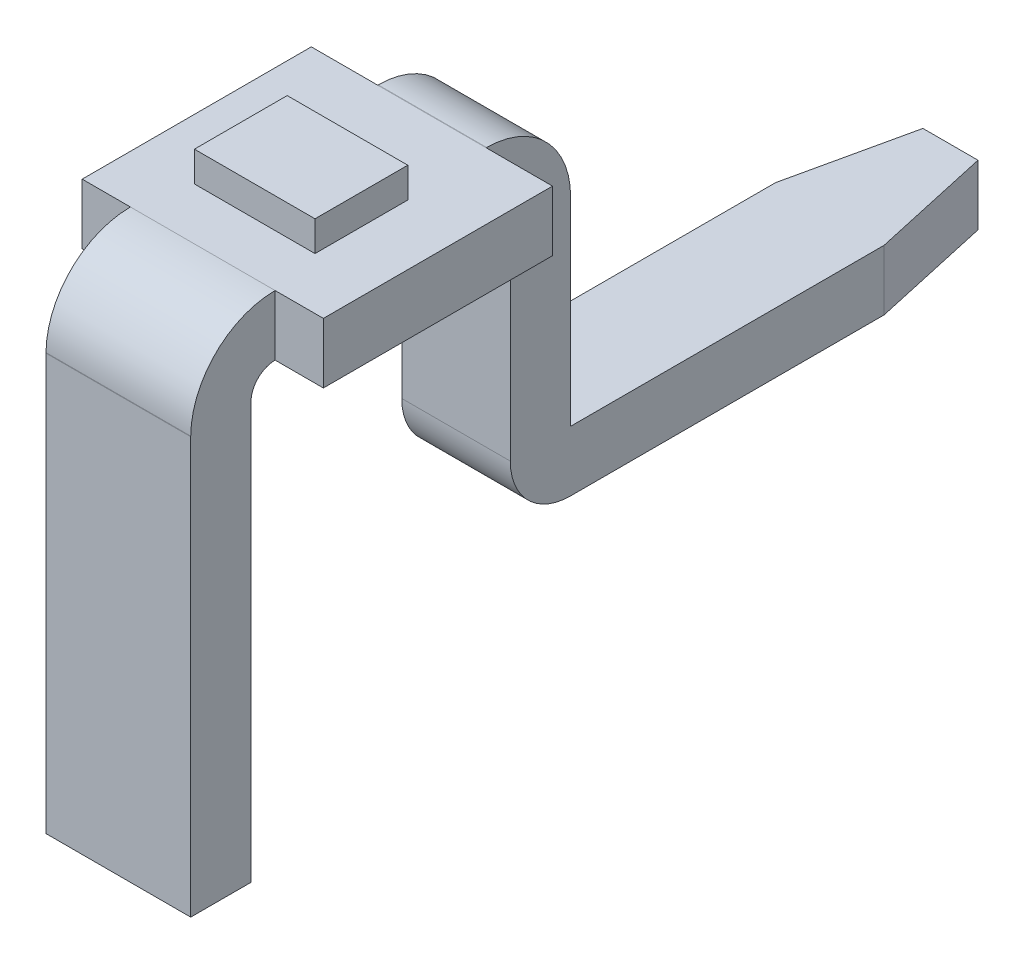
ISO-10303-21;
HEADER;
FILE_DESCRIPTION(('STEP AP214'),'2;1');
FILE_NAME('part.step','',(''),(''),'','','');
FILE_SCHEMA(('AUTOMOTIVE_DESIGN { 1 0 10303 214 1 1 1 1 }'));
ENDSEC;
DATA;
#1=APPLICATION_CONTEXT('core data for automotive mechanical design processes');
#2=APPLICATION_PROTOCOL_DEFINITION('international standard','automotive_design',2000,#1);
#3=PRODUCT_CONTEXT('',#1,'mechanical');
#4=PRODUCT('Part','Part','',(#3));
#5=PRODUCT_RELATED_PRODUCT_CATEGORY('part','',(#4));
#6=PRODUCT_DEFINITION_FORMATION('','',#4);
#7=PRODUCT_DEFINITION_CONTEXT('part definition',#1,'design');
#8=PRODUCT_DEFINITION('design','',#6,#7);
#9=PRODUCT_DEFINITION_SHAPE('','',#8);
#10=(LENGTH_UNIT() NAMED_UNIT(*) SI_UNIT(.MILLI.,.METRE.));
#11=(NAMED_UNIT(*) PLANE_ANGLE_UNIT() SI_UNIT($,.RADIAN.));
#12=(NAMED_UNIT(*) SI_UNIT($,.STERADIAN.) SOLID_ANGLE_UNIT());
#13=UNCERTAINTY_MEASURE_WITH_UNIT(LENGTH_MEASURE(1.E-05),#10,'distance_accuracy_value','');
#14=(GEOMETRIC_REPRESENTATION_CONTEXT(3) GLOBAL_UNCERTAINTY_ASSIGNED_CONTEXT((#13)) GLOBAL_UNIT_ASSIGNED_CONTEXT((#10,
#11,#12)) REPRESENTATION_CONTEXT('',''));
#15=CARTESIAN_POINT('',(0.,0.,0.));
#16=DIRECTION('',(0.,0.,1.));
#17=DIRECTION('',(1.,0.,0.));
#18=AXIS2_PLACEMENT_3D('',#15,#16,#17);
#19=CARTESIAN_POINT('',(12.13500315,5.95625315000024,2.26942088429381));
#20=DIRECTION('',(0.,0.,1.));
#21=DIRECTION('',(1.,0.,0.));
#22=AXIS2_PLACEMENT_3D('',#19,#20,#21);
#23=PLANE('',#22);
#24=DIRECTION('',(1.,0.,0.));
#25=VECTOR('',#24,1.);
#26=CARTESIAN_POINT('',(11.11,5.70000000000024,2.26942088429381));
#27=LINE('',#26,#25);
#28=CARTESIAN_POINT('',(11.11,5.70000000000024,2.26942088429381));
#29=VERTEX_POINT('',#28);
#30=CARTESIAN_POINT('',(12.11,5.70000000000024,2.26942088429381));
#31=VERTEX_POINT('',#30);
#32=EDGE_CURVE('E390',#29,#31,#27,.T.);
#33=ORIENTED_EDGE('',*,*,#32,.T.);
#34=DIRECTION('',(0.,1.,0.));
#35=VECTOR('',#34,1.);
#36=CARTESIAN_POINT('',(12.11,5.70000000000024,2.26942088429381));
#37=LINE('',#36,#35);
#38=CARTESIAN_POINT('',(12.11,5.95000000000024,2.26942088429381));
#39=VERTEX_POINT('',#38);
#40=EDGE_CURVE('E19',#31,#39,#37,.T.);
#41=ORIENTED_EDGE('',*,*,#40,.T.);
#42=DIRECTION('',(1.,0.,0.));
#43=VECTOR('',#42,1.);
#44=CARTESIAN_POINT('',(11.11,5.95000000000024,2.26942088429381));
#45=LINE('',#44,#43);
#46=CARTESIAN_POINT('',(11.11,5.95000000000024,2.26942088429381));
#47=VERTEX_POINT('',#46);
#48=EDGE_CURVE('E10',#47,#39,#45,.T.);
#49=ORIENTED_EDGE('',*,*,#48,.F.);
#50=DIRECTION('',(0.,1.,0.));
#51=VECTOR('',#50,1.);
#52=CARTESIAN_POINT('',(11.11,5.70000000000024,2.26942088429381));
#53=LINE('',#52,#51);
#54=EDGE_CURVE('E549',#29,#47,#53,.T.);
#55=ORIENTED_EDGE('',*,*,#54,.F.);
#56=EDGE_LOOP('',(#33,#41,#49,#55));
#57=FACE_BOUND('',#56,.T.);
#58=ADVANCED_FACE('F15',(#57),#23,.T.);
#59=CARTESIAN_POINT('',(12.13500315,5.95000000000024,1.48076132789265));
#60=DIRECTION('',(0.,1.,0.));
#61=DIRECTION('',(1.,0.,0.));
#62=AXIS2_PLACEMENT_3D('',#59,#60,#61);
#63=PLANE('',#62);
#64=DIRECTION('',(0.,0.,-1.));
#65=VECTOR('',#64,1.);
#66=CARTESIAN_POINT('',(12.11,5.95000000000024,2.26942088429381));
#67=LINE('',#66,#65);
#68=CARTESIAN_POINT('',(12.11,5.95000000000024,1.5));
#69=VERTEX_POINT('',#68);
#70=EDGE_CURVE('E267',#39,#69,#67,.T.);
#71=ORIENTED_EDGE('',*,*,#70,.T.);
#72=DIRECTION('',(1.,0.,0.));
#73=VECTOR('',#72,1.);
#74=CARTESIAN_POINT('',(11.11,5.95000000000024,1.5));
#75=LINE('',#74,#73);
#76=CARTESIAN_POINT('',(11.11,5.95000000000024,1.5));
#77=VERTEX_POINT('',#76);
#78=EDGE_CURVE('E458',#77,#69,#75,.T.);
#79=ORIENTED_EDGE('',*,*,#78,.F.);
#80=DIRECTION('',(0.,0.,1.));
#81=VECTOR('',#80,1.);
#82=CARTESIAN_POINT('',(11.11,5.95000000000024,1.5));
#83=LINE('',#82,#81);
#84=EDGE_CURVE('E270',#77,#47,#83,.T.);
#85=ORIENTED_EDGE('',*,*,#84,.T.);
#86=ORIENTED_EDGE('',*,*,#48,.T.);
#87=EDGE_LOOP('',(#71,#79,#85,#86));
#88=FACE_BOUND('',#87,.T.);
#89=ADVANCED_FACE('F17',(#88),#63,.T.);
#90=CARTESIAN_POINT('',(12.11,5.95625315000024,1.48076132789265));
#91=DIRECTION('',(1.,0.,0.));
#92=DIRECTION('',(0.,1.,0.));
#93=AXIS2_PLACEMENT_3D('',#90,#91,#92);
#94=PLANE('',#93);
#95=DIRECTION('',(0.,0.,-1.));
#96=VECTOR('',#95,1.);
#97=CARTESIAN_POINT('',(12.11,5.70000000000024,2.26942088429381));
#98=LINE('',#97,#96);
#99=CARTESIAN_POINT('',(12.11,5.70000000000024,1.5));
#100=VERTEX_POINT('',#99);
#101=EDGE_CURVE('E403',#31,#100,#98,.T.);
#102=ORIENTED_EDGE('',*,*,#101,.T.);
#103=DIRECTION('',(0.,-1.,0.));
#104=VECTOR('',#103,1.);
#105=CARTESIAN_POINT('',(12.11,5.95000000000024,1.5));
#106=LINE('',#105,#104);
#107=EDGE_CURVE('E310',#69,#100,#106,.T.);
#108=ORIENTED_EDGE('',*,*,#107,.F.);
#109=ORIENTED_EDGE('',*,*,#70,.F.);
#110=ORIENTED_EDGE('',*,*,#40,.F.);
#111=EDGE_LOOP('',(#102,#108,#109,#110));
#112=FACE_BOUND('',#111,.T.);
#113=ADVANCED_FACE('F569',(#112),#94,.T.);
#114=CARTESIAN_POINT('',(11.11,5.95625315000024,2.28865955640116));
#115=DIRECTION('',(-1.,0.,0.));
#116=DIRECTION('',(0.,0.,1.));
#117=AXIS2_PLACEMENT_3D('',#114,#115,#116);
#118=PLANE('',#117);
#119=DIRECTION('',(0.,0.,1.));
#120=VECTOR('',#119,1.);
#121=CARTESIAN_POINT('',(11.11,5.70000000000024,1.5));
#122=LINE('',#121,#120);
#123=CARTESIAN_POINT('',(11.11,5.70000000000024,1.5));
#124=VERTEX_POINT('',#123);
#125=EDGE_CURVE('E399',#124,#29,#122,.T.);
#126=ORIENTED_EDGE('',*,*,#125,.T.);
#127=ORIENTED_EDGE('',*,*,#54,.T.);
#128=ORIENTED_EDGE('',*,*,#84,.F.);
#129=DIRECTION('',(0.,-1.,0.));
#130=VECTOR('',#129,1.);
#131=CARTESIAN_POINT('',(11.11,5.95000000000024,1.5));
#132=LINE('',#131,#130);
#133=EDGE_CURVE('E451',#77,#124,#132,.T.);
#134=ORIENTED_EDGE('',*,*,#133,.T.);
#135=EDGE_LOOP('',(#126,#127,#128,#134));
#136=FACE_BOUND('',#135,.T.);
#137=ADVANCED_FACE('F560',(#136),#118,.T.);
#138=CARTESIAN_POINT('',(11.3872377109938,3.36250315000024,-3.52500307533242));
#139=DIRECTION('',(0.976296007119933,0.,0.216439613938103));
#140=DIRECTION('',(0.,-1.,0.));
#141=AXIS2_PLACEMENT_3D('',#138,#139,#140);
#142=PLANE('',#141);
#143=DIRECTION('',(0.216439613938103,0.,-0.976296007119933));
#144=VECTOR('',#143,1.);
#145=CARTESIAN_POINT('',(11.16,3.35000000000024,-2.5));
#146=LINE('',#145,#144);
#147=CARTESIAN_POINT('',(11.16,3.35000000000024,-2.5));
#148=VERTEX_POINT('',#147);
#149=CARTESIAN_POINT('',(11.3816946626429,3.35000000000024,-3.5));
#150=VERTEX_POINT('',#149);
#151=EDGE_CURVE('E245',#148,#150,#146,.T.);
#152=ORIENTED_EDGE('',*,*,#151,.T.);
#153=DIRECTION('',(0.,-1.,0.));
#154=VECTOR('',#153,1.);
#155=CARTESIAN_POINT('',(11.3816946626429,3.35000000000024,-3.5));
#156=LINE('',#155,#154);
#157=CARTESIAN_POINT('',(11.3816946626429,2.85000000000024,-3.5));
#158=VERTEX_POINT('',#157);
#159=EDGE_CURVE('E389',#150,#158,#156,.T.);
#160=ORIENTED_EDGE('',*,*,#159,.T.);
#161=DIRECTION('',(-0.216439613938103,0.,0.976296007119933));
#162=VECTOR('',#161,1.);
#163=CARTESIAN_POINT('',(11.3816946626429,2.85000000000024,-3.5));
#164=LINE('',#163,#162);
#165=CARTESIAN_POINT('',(11.16,2.85000000000024,-2.5));
#166=VERTEX_POINT('',#165);
#167=EDGE_CURVE('E262',#158,#166,#164,.T.);
#168=ORIENTED_EDGE('',*,*,#167,.T.);
#169=DIRECTION('',(0.,-1.,0.));
#170=VECTOR('',#169,1.);
#171=CARTESIAN_POINT('',(11.16,3.35000000000024,-2.5));
#172=LINE('',#171,#170);
#173=EDGE_CURVE('E535',#148,#166,#172,.T.);
#174=ORIENTED_EDGE('',*,*,#173,.F.);
#175=EDGE_LOOP('',(#152,#160,#168,#174));
#176=FACE_BOUND('',#175,.T.);
#177=ADVANCED_FACE('F648',(#176),#142,.F.);
#178=CARTESIAN_POINT('',(12.0655430483509,3.36250315000024,-2.47499692466758));
#179=DIRECTION('',(-0.976296007119933,0.,0.216439613938103));
#180=DIRECTION('',(0.,1.,0.));
#181=AXIS2_PLACEMENT_3D('',#178,#179,#180);
#182=PLANE('',#181);
#183=DIRECTION('',(-0.216439613938103,0.,-0.976296007119933));
#184=VECTOR('',#183,1.);
#185=CARTESIAN_POINT('',(12.06,2.85000000000024,-2.5));
#186=LINE('',#185,#184);
#187=CARTESIAN_POINT('',(12.06,2.85000000000024,-2.5));
#188=VERTEX_POINT('',#187);
#189=CARTESIAN_POINT('',(11.8383053373571,2.85000000000024,-3.5));
#190=VERTEX_POINT('',#189);
#191=EDGE_CURVE('E425',#188,#190,#186,.T.);
#192=ORIENTED_EDGE('',*,*,#191,.T.);
#193=DIRECTION('',(0.,1.,0.));
#194=VECTOR('',#193,1.);
#195=CARTESIAN_POINT('',(11.8383053373571,2.85000000000024,-3.5));
#196=LINE('',#195,#194);
#197=CARTESIAN_POINT('',(11.8383053373571,3.35000000000024,-3.5));
#198=VERTEX_POINT('',#197);
#199=EDGE_CURVE('E385',#190,#198,#196,.T.);
#200=ORIENTED_EDGE('',*,*,#199,.T.);
#201=DIRECTION('',(0.216439613938103,0.,0.976296007119933));
#202=VECTOR('',#201,1.);
#203=CARTESIAN_POINT('',(11.8383053373571,3.35000000000024,-3.5));
#204=LINE('',#203,#202);
#205=CARTESIAN_POINT('',(12.06,3.35000000000024,-2.5));
#206=VERTEX_POINT('',#205);
#207=EDGE_CURVE('E514',#198,#206,#204,.T.);
#208=ORIENTED_EDGE('',*,*,#207,.T.);
#209=DIRECTION('',(0.,1.,0.));
#210=VECTOR('',#209,1.);
#211=CARTESIAN_POINT('',(12.06,2.85000000000024,-2.5));
#212=LINE('',#211,#210);
#213=EDGE_CURVE('E546',#188,#206,#212,.T.);
#214=ORIENTED_EDGE('',*,*,#213,.F.);
#215=EDGE_LOOP('',(#192,#200,#208,#214));
#216=FACE_BOUND('',#215,.T.);
#217=ADVANCED_FACE('F645',(#216),#182,.F.);
#218=CARTESIAN_POINT('',(12.06,5.77125315000024,0.882503150000004));
#219=DIRECTION('',(-1.,0.,0.));
#220=DIRECTION('',(0.,0.,1.));
#221=AXIS2_PLACEMENT_3D('',#218,#219,#220);
#222=PLANE('',#221);
#223=CARTESIAN_POINT('',(12.06,5.00000000000024,0.8));
#224=DIRECTION('',(-1.,0.,0.));
#225=DIRECTION('',(0.,1.,0.));
#226=AXIS2_PLACEMENT_3D('',#223,#224,#225);
#227=CIRCLE('',#226,0.2);
#228=CARTESIAN_POINT('',(12.06,5.20000000000024,0.8));
#229=VERTEX_POINT('',#228);
#230=CARTESIAN_POINT('',(12.06,5.1999959756164,0.798731245753716));
#231=VERTEX_POINT('',#230);
#232=EDGE_CURVE('E244',#229,#231,#227,.T.);
#233=ORIENTED_EDGE('',*,*,#232,.T.);
#234=CARTESIAN_POINT('',(12.06,5.00000000000024,0.8));
#235=DIRECTION('',(-1.,0.,0.));
#236=DIRECTION('',(0.,1.,0.));
#237=AXIS2_PLACEMENT_3D('',#234,#235,#236);
#238=CIRCLE('',#237,0.2);
#239=CARTESIAN_POINT('',(12.06,5.00000000000024,0.6));
#240=VERTEX_POINT('',#239);
#241=EDGE_CURVE('E287',#231,#240,#238,.T.);
#242=ORIENTED_EDGE('',*,*,#241,.T.);
#243=DIRECTION('',(0.,1.,0.));
#244=VECTOR('',#243,1.);
#245=CARTESIAN_POINT('',(12.06,3.35000000000024,0.6));
#246=LINE('',#245,#244);
#247=CARTESIAN_POINT('',(12.06,3.35000000000024,0.6));
#248=VERTEX_POINT('',#247);
#249=EDGE_CURVE('E476',#248,#240,#246,.T.);
#250=ORIENTED_EDGE('',*,*,#249,.F.);
#251=CARTESIAN_POINT('',(12.06,3.35000000000024,0.1));
#252=DIRECTION('',(-1.,0.,0.));
#253=DIRECTION('',(0.,-1.,0.));
#254=AXIS2_PLACEMENT_3D('',#251,#252,#253);
#255=CIRCLE('',#254,0.5);
#256=CARTESIAN_POINT('',(12.06,2.85001006095982,0.103171885615719));
#257=VERTEX_POINT('',#256);
#258=EDGE_CURVE('E278',#257,#248,#255,.T.);
#259=ORIENTED_EDGE('',*,*,#258,.F.);
#260=CARTESIAN_POINT('',(12.06,3.35000000000024,0.1));
#261=DIRECTION('',(-1.,0.,0.));
#262=DIRECTION('',(0.,-1.,0.));
#263=AXIS2_PLACEMENT_3D('',#260,#261,#262);
#264=CIRCLE('',#263,0.5);
#265=CARTESIAN_POINT('',(12.06,2.85000000000024,0.1));
#266=VERTEX_POINT('',#265);
#267=EDGE_CURVE('E442',#266,#257,#264,.T.);
#268=ORIENTED_EDGE('',*,*,#267,.F.);
#269=DIRECTION('',(0.,0.,1.));
#270=VECTOR('',#269,1.);
#271=CARTESIAN_POINT('',(12.06,2.85000000000024,-2.5));
#272=LINE('',#271,#270);
#273=EDGE_CURVE('E435',#188,#266,#272,.T.);
#274=ORIENTED_EDGE('',*,*,#273,.F.);
#275=ORIENTED_EDGE('',*,*,#213,.T.);
#276=DIRECTION('',(0.,0.,-1.));
#277=VECTOR('',#276,1.);
#278=CARTESIAN_POINT('',(12.06,3.35000000000024,0.1));
#279=LINE('',#278,#277);
#280=CARTESIAN_POINT('',(12.06,3.35000000000024,0.1));
#281=VERTEX_POINT('',#280);
#282=EDGE_CURVE('E431',#281,#206,#279,.T.);
#283=ORIENTED_EDGE('',*,*,#282,.F.);
#284=DIRECTION('',(0.,-1.,0.));
#285=VECTOR('',#284,1.);
#286=CARTESIAN_POINT('',(12.06,5.00000000000024,0.1));
#287=LINE('',#286,#285);
#288=CARTESIAN_POINT('',(12.06,5.00000000000024,0.1));
#289=VERTEX_POINT('',#288);
#290=EDGE_CURVE('E228',#289,#281,#287,.T.);
#291=ORIENTED_EDGE('',*,*,#290,.F.);
#292=CARTESIAN_POINT('',(12.06,5.00000000000024,0.8));
#293=DIRECTION('',(-1.,0.,0.));
#294=DIRECTION('',(0.,1.,0.));
#295=AXIS2_PLACEMENT_3D('',#292,#293,#294);
#296=CIRCLE('',#295,0.7);
#297=CARTESIAN_POINT('',(12.06,5.69998591465682,0.795559360138));
#298=VERTEX_POINT('',#297);
#299=EDGE_CURVE('E225',#298,#289,#296,.T.);
#300=ORIENTED_EDGE('',*,*,#299,.F.);
#301=CARTESIAN_POINT('',(12.06,5.00000000000024,0.8));
#302=DIRECTION('',(-1.,0.,0.));
#303=DIRECTION('',(0.,1.,0.));
#304=AXIS2_PLACEMENT_3D('',#301,#302,#303);
#305=CIRCLE('',#304,0.7);
#306=CARTESIAN_POINT('',(12.06,5.70000000000024,0.8));
#307=VERTEX_POINT('',#306);
#308=EDGE_CURVE('E210',#307,#298,#305,.T.);
#309=ORIENTED_EDGE('',*,*,#308,.F.);
#310=DIRECTION('',(0.,1.,0.));
#311=VECTOR('',#310,1.);
#312=CARTESIAN_POINT('',(12.06,5.20000000000024,0.8));
#313=LINE('',#312,#311);
#314=EDGE_CURVE('E374',#229,#307,#313,.T.);
#315=ORIENTED_EDGE('',*,*,#314,.F.);
#316=EDGE_LOOP('',(#233,#242,#250,#259,#268,#274,#275,#283,#291,#300,#309,#315));
#317=FACE_BOUND('',#316,.T.);
#318=ADVANCED_FACE('F226',(#317),#222,.F.);
#319=CARTESIAN_POINT('',(12.62375315,5.71250315000024,0.8));
#320=DIRECTION('',(0.,0.,1.));
#321=DIRECTION('',(1.,0.,0.));
#322=AXIS2_PLACEMENT_3D('',#319,#320,#321);
#323=PLANE('',#322);
#324=DIRECTION('',(-1.,0.,0.));
#325=VECTOR('',#324,1.);
#326=CARTESIAN_POINT('',(12.61,5.20000000000024,0.8));
#327=LINE('',#326,#325);
#328=CARTESIAN_POINT('',(12.61,5.20000000000024,0.8));
#329=VERTEX_POINT('',#328);
#330=EDGE_CURVE('E538',#329,#229,#327,.T.);
#331=ORIENTED_EDGE('',*,*,#330,.T.);
#332=ORIENTED_EDGE('',*,*,#314,.T.);
#333=DIRECTION('',(1.,0.,0.));
#334=VECTOR('',#333,1.);
#335=CARTESIAN_POINT('',(12.06,5.70000000000024,0.8));
#336=LINE('',#335,#334);
#337=CARTESIAN_POINT('',(12.61,5.70000000000024,0.8));
#338=VERTEX_POINT('',#337);
#339=EDGE_CURVE('E356',#307,#338,#336,.T.);
#340=ORIENTED_EDGE('',*,*,#339,.T.);
#341=DIRECTION('',(0.,-1.,0.));
#342=VECTOR('',#341,1.);
#343=CARTESIAN_POINT('',(12.61,5.70000000000024,0.8));
#344=LINE('',#343,#342);
#345=EDGE_CURVE('E340',#338,#329,#344,.T.);
#346=ORIENTED_EDGE('',*,*,#345,.T.);
#347=EDGE_LOOP('',(#331,#332,#340,#346));
#348=FACE_BOUND('',#347,.T.);
#349=ADVANCED_FACE('F638',(#348),#323,.F.);
#350=CARTESIAN_POINT('',(11.17375315,5.71250315000024,0.8));
#351=DIRECTION('',(0.,0.,-1.));
#352=DIRECTION('',(0.,-1.,0.));
#353=AXIS2_PLACEMENT_3D('',#350,#351,#352);
#354=PLANE('',#353);
#355=DIRECTION('',(-1.,0.,0.));
#356=VECTOR('',#355,1.);
#357=CARTESIAN_POINT('',(11.16,5.20000000000024,0.8));
#358=LINE('',#357,#356);
#359=CARTESIAN_POINT('',(11.16,5.20000000000024,0.8));
#360=VERTEX_POINT('',#359);
#361=CARTESIAN_POINT('',(10.61,5.20000000000024,0.8));
#362=VERTEX_POINT('',#361);
#363=EDGE_CURVE('E371',#360,#362,#358,.T.);
#364=ORIENTED_EDGE('',*,*,#363,.T.);
#365=DIRECTION('',(0.,-1.,0.));
#366=VECTOR('',#365,1.);
#367=CARTESIAN_POINT('',(10.61,5.70000000000024,0.8));
#368=LINE('',#367,#366);
#369=CARTESIAN_POINT('',(10.61,5.70000000000024,0.8));
#370=VERTEX_POINT('',#369);
#371=EDGE_CURVE('E322',#370,#362,#368,.T.);
#372=ORIENTED_EDGE('',*,*,#371,.F.);
#373=DIRECTION('',(1.,0.,0.));
#374=VECTOR('',#373,1.);
#375=CARTESIAN_POINT('',(10.61,5.70000000000024,0.8));
#376=LINE('',#375,#374);
#377=CARTESIAN_POINT('',(11.16,5.70000000000024,0.8));
#378=VERTEX_POINT('',#377);
#379=EDGE_CURVE('E376',#370,#378,#376,.T.);
#380=ORIENTED_EDGE('',*,*,#379,.T.);
#381=DIRECTION('',(0.,1.,0.));
#382=VECTOR('',#381,1.);
#383=CARTESIAN_POINT('',(11.16,5.20000000000024,0.8));
#384=LINE('',#383,#382);
#385=EDGE_CURVE('E367',#360,#378,#384,.T.);
#386=ORIENTED_EDGE('',*,*,#385,.F.);
#387=EDGE_LOOP('',(#364,#372,#380,#386));
#388=FACE_BOUND('',#387,.T.);
#389=ADVANCED_FACE('F634',(#388),#354,.T.);
#390=CARTESIAN_POINT('',(12.62000315,5.18749685000024,2.7));
#391=DIRECTION('',(0.,0.,1.));
#392=DIRECTION('',(1.,0.,0.));
#393=AXIS2_PLACEMENT_3D('',#390,#391,#392);
#394=PLANE('',#393);
#395=DIRECTION('',(0.,1.,0.));
#396=VECTOR('',#395,1.);
#397=CARTESIAN_POINT('',(12.21,5.20000000000024,2.7));
#398=LINE('',#397,#396);
#399=CARTESIAN_POINT('',(12.21,5.20000000000024,2.7));
#400=VERTEX_POINT('',#399);
#401=CARTESIAN_POINT('',(12.21,5.70000000000024,2.7));
#402=VERTEX_POINT('',#401);
#403=EDGE_CURVE('E339',#400,#402,#398,.T.);
#404=ORIENTED_EDGE('',*,*,#403,.F.);
#405=DIRECTION('',(1.,0.,0.));
#406=VECTOR('',#405,1.);
#407=CARTESIAN_POINT('',(12.21,5.20000000000024,2.7));
#408=LINE('',#407,#406);
#409=CARTESIAN_POINT('',(12.61,5.20000000000024,2.7));
#410=VERTEX_POINT('',#409);
#411=EDGE_CURVE('E375',#400,#410,#408,.T.);
#412=ORIENTED_EDGE('',*,*,#411,.T.);
#413=DIRECTION('',(0.,-1.,0.));
#414=VECTOR('',#413,1.);
#415=CARTESIAN_POINT('',(12.61,5.70000000000024,2.7));
#416=LINE('',#415,#414);
#417=CARTESIAN_POINT('',(12.61,5.70000000000024,2.7));
#418=VERTEX_POINT('',#417);
#419=EDGE_CURVE('E522',#418,#410,#416,.T.);
#420=ORIENTED_EDGE('',*,*,#419,.F.);
#421=DIRECTION('',(1.,0.,0.));
#422=VECTOR('',#421,1.);
#423=CARTESIAN_POINT('',(12.21,5.70000000000024,2.7));
#424=LINE('',#423,#422);
#425=EDGE_CURVE('E380',#402,#418,#424,.T.);
#426=ORIENTED_EDGE('',*,*,#425,.F.);
#427=EDGE_LOOP('',(#404,#412,#420,#426));
#428=FACE_BOUND('',#427,.T.);
#429=ADVANCED_FACE('F630',(#428),#394,.T.);
#430=CARTESIAN_POINT('',(12.66000315,5.20000000000024,0.752496850000004));
#431=DIRECTION('',(0.,-1.,0.));
#432=DIRECTION('',(0.,0.,-1.));
#433=AXIS2_PLACEMENT_3D('',#430,#431,#432);
#434=PLANE('',#433);
#435=ORIENTED_EDGE('',*,*,#330,.F.);
#436=DIRECTION('',(0.,0.,1.));
#437=VECTOR('',#436,1.);
#438=CARTESIAN_POINT('',(12.61,5.20000000000024,0.8));
#439=LINE('',#438,#437);
#440=EDGE_CURVE('E526',#329,#410,#439,.T.);
#441=ORIENTED_EDGE('',*,*,#440,.T.);
#442=ORIENTED_EDGE('',*,*,#411,.F.);
#443=DIRECTION('',(-1.,0.,0.));
#444=VECTOR('',#443,1.);
#445=CARTESIAN_POINT('',(12.21,5.20000000000024,2.7));
#446=LINE('',#445,#444);
#447=CARTESIAN_POINT('',(11.01,5.20000000000024,2.7));
#448=VERTEX_POINT('',#447);
#449=EDGE_CURVE('E321',#400,#448,#446,.T.);
#450=ORIENTED_EDGE('',*,*,#449,.T.);
#451=DIRECTION('',(-1.,0.,0.));
#452=VECTOR('',#451,1.);
#453=CARTESIAN_POINT('',(11.01,5.20000000000024,2.7));
#454=LINE('',#453,#452);
#455=CARTESIAN_POINT('',(10.61,5.20000000000024,2.7));
#456=VERTEX_POINT('',#455);
#457=EDGE_CURVE('E394',#448,#456,#454,.T.);
#458=ORIENTED_EDGE('',*,*,#457,.T.);
#459=DIRECTION('',(0.,0.,1.));
#460=VECTOR('',#459,1.);
#461=CARTESIAN_POINT('',(10.61,5.20000000000024,0.8));
#462=LINE('',#461,#460);
#463=EDGE_CURVE('E326',#362,#456,#462,.T.);
#464=ORIENTED_EDGE('',*,*,#463,.F.);
#465=ORIENTED_EDGE('',*,*,#363,.F.);
#466=DIRECTION('',(-1.,0.,0.));
#467=VECTOR('',#466,1.);
#468=CARTESIAN_POINT('',(12.06,5.20000000000024,0.8));
#469=LINE('',#468,#467);
#470=EDGE_CURVE('E454',#229,#360,#469,.T.);
#471=ORIENTED_EDGE('',*,*,#470,.F.);
#472=EDGE_LOOP('',(#435,#441,#442,#450,#458,#464,#465,#471));
#473=FACE_BOUND('',#472,.T.);
#474=ADVANCED_FACE('F626',(#473),#434,.T.);
#475=CARTESIAN_POINT('',(11.16,5.77125315000024,-2.58250315));
#476=DIRECTION('',(1.,0.,0.));
#477=DIRECTION('',(0.,1.,0.));
#478=AXIS2_PLACEMENT_3D('',#475,#476,#477);
#479=PLANE('',#478);
#480=CARTESIAN_POINT('',(11.16,5.00000000000024,0.8));
#481=DIRECTION('',(-1.,0.,0.));
#482=DIRECTION('',(0.,1.,0.));
#483=AXIS2_PLACEMENT_3D('',#480,#481,#482);
#484=CIRCLE('',#483,0.2);
#485=CARTESIAN_POINT('',(11.16,5.1999959756164,0.798731245753716));
#486=VERTEX_POINT('',#485);
#487=EDGE_CURVE('E304',#360,#486,#484,.T.);
#488=ORIENTED_EDGE('',*,*,#487,.F.);
#489=ORIENTED_EDGE('',*,*,#385,.T.);
#490=CARTESIAN_POINT('',(11.16,5.00000000000024,0.8));
#491=DIRECTION('',(-1.,0.,0.));
#492=DIRECTION('',(0.,1.,0.));
#493=AXIS2_PLACEMENT_3D('',#490,#491,#492);
#494=CIRCLE('',#493,0.7);
#495=CARTESIAN_POINT('',(11.16,5.69998591465682,0.795559360138));
#496=VERTEX_POINT('',#495);
#497=EDGE_CURVE('E222',#378,#496,#494,.T.);
#498=ORIENTED_EDGE('',*,*,#497,.T.);
#499=CARTESIAN_POINT('',(11.16,5.00000000000024,0.8));
#500=DIRECTION('',(-1.,0.,0.));
#501=DIRECTION('',(0.,1.,0.));
#502=AXIS2_PLACEMENT_3D('',#499,#500,#501);
#503=CIRCLE('',#502,0.7);
#504=CARTESIAN_POINT('',(11.16,5.00000000000024,0.1));
#505=VERTEX_POINT('',#504);
#506=EDGE_CURVE('E238',#496,#505,#503,.T.);
#507=ORIENTED_EDGE('',*,*,#506,.T.);
#508=DIRECTION('',(0.,1.,0.));
#509=VECTOR('',#508,1.);
#510=CARTESIAN_POINT('',(11.16,3.35000000000024,0.1));
#511=LINE('',#510,#509);
#512=CARTESIAN_POINT('',(11.16,3.35000000000024,0.1));
#513=VERTEX_POINT('',#512);
#514=EDGE_CURVE('E415',#513,#505,#511,.T.);
#515=ORIENTED_EDGE('',*,*,#514,.F.);
#516=DIRECTION('',(0.,0.,1.));
#517=VECTOR('',#516,1.);
#518=CARTESIAN_POINT('',(11.16,3.35000000000024,-2.5));
#519=LINE('',#518,#517);
#520=EDGE_CURVE('E241',#148,#513,#519,.T.);
#521=ORIENTED_EDGE('',*,*,#520,.F.);
#522=ORIENTED_EDGE('',*,*,#173,.T.);
#523=DIRECTION('',(0.,0.,-1.));
#524=VECTOR('',#523,1.);
#525=CARTESIAN_POINT('',(11.16,2.85000000000024,0.1));
#526=LINE('',#525,#524);
#527=CARTESIAN_POINT('',(11.16,2.85000000000024,0.1));
#528=VERTEX_POINT('',#527);
#529=EDGE_CURVE('E258',#528,#166,#526,.T.);
#530=ORIENTED_EDGE('',*,*,#529,.F.);
#531=CARTESIAN_POINT('',(11.16,3.35000000000024,0.1));
#532=DIRECTION('',(-1.,0.,0.));
#533=DIRECTION('',(0.,-1.,0.));
#534=AXIS2_PLACEMENT_3D('',#531,#532,#533);
#535=CIRCLE('',#534,0.5);
#536=CARTESIAN_POINT('',(11.16,2.85001006095982,0.103171885615719));
#537=VERTEX_POINT('',#536);
#538=EDGE_CURVE('E439',#528,#537,#535,.T.);
#539=ORIENTED_EDGE('',*,*,#538,.T.);
#540=CARTESIAN_POINT('',(11.16,3.35000000000024,0.1));
#541=DIRECTION('',(-1.,0.,0.));
#542=DIRECTION('',(0.,-1.,0.));
#543=AXIS2_PLACEMENT_3D('',#540,#541,#542);
#544=CIRCLE('',#543,0.5);
#545=CARTESIAN_POINT('',(11.16,3.35000000000024,0.6));
#546=VERTEX_POINT('',#545);
#547=EDGE_CURVE('E291',#537,#546,#544,.T.);
#548=ORIENTED_EDGE('',*,*,#547,.T.);
#549=DIRECTION('',(0.,-1.,0.));
#550=VECTOR('',#549,1.);
#551=CARTESIAN_POINT('',(11.16,5.00000000000024,0.6));
#552=LINE('',#551,#550);
#553=CARTESIAN_POINT('',(11.16,5.00000000000024,0.6));
#554=VERTEX_POINT('',#553);
#555=EDGE_CURVE('E221',#554,#546,#552,.T.);
#556=ORIENTED_EDGE('',*,*,#555,.F.);
#557=CARTESIAN_POINT('',(11.16,5.00000000000024,0.8));
#558=DIRECTION('',(-1.,0.,0.));
#559=DIRECTION('',(0.,1.,0.));
#560=AXIS2_PLACEMENT_3D('',#557,#558,#559);
#561=CIRCLE('',#560,0.2);
#562=EDGE_CURVE('E273',#486,#554,#561,.T.);
#563=ORIENTED_EDGE('',*,*,#562,.F.);
#564=EDGE_LOOP('',(#488,#489,#498,#507,#515,#521,#522,#530,#539,#548,#556,#563));
#565=FACE_BOUND('',#564,.T.);
#566=ADVANCED_FACE('F622',(#565),#479,.F.);
#567=CARTESIAN_POINT('',(12.21,5.80375315000024,3.41750315));
#568=DIRECTION('',(-1.,0.,0.));
#569=DIRECTION('',(0.,0.,1.));
#570=AXIS2_PLACEMENT_3D('',#567,#568,#569);
#571=PLANE('',#570);
#572=CARTESIAN_POINT('',(12.21,5.00000000000024,2.7));
#573=DIRECTION('',(-1.,0.,0.));
#574=DIRECTION('',(0.,0.,1.));
#575=AXIS2_PLACEMENT_3D('',#572,#573,#574);
#576=CIRCLE('',#575,0.2);
#577=CARTESIAN_POINT('',(12.21,5.00000000000024,2.9));
#578=VERTEX_POINT('',#577);
#579=CARTESIAN_POINT('',(12.21,5.00126875424652,2.89999597561617));
#580=VERTEX_POINT('',#579);
#581=EDGE_CURVE('E398',#578,#580,#576,.T.);
#582=ORIENTED_EDGE('',*,*,#581,.T.);
#583=CARTESIAN_POINT('',(12.21,5.00000000000024,2.7));
#584=DIRECTION('',(-1.,0.,0.));
#585=DIRECTION('',(0.,0.,1.));
#586=AXIS2_PLACEMENT_3D('',#583,#584,#585);
#587=CIRCLE('',#586,0.2);
#588=EDGE_CURVE('E331',#580,#400,#587,.T.);
#589=ORIENTED_EDGE('',*,*,#588,.T.);
#590=ORIENTED_EDGE('',*,*,#403,.T.);
#591=CARTESIAN_POINT('',(12.21,5.00000000000024,2.7));
#592=DIRECTION('',(-1.,0.,0.));
#593=DIRECTION('',(0.,0.,1.));
#594=AXIS2_PLACEMENT_3D('',#591,#592,#593);
#595=CIRCLE('',#594,0.7);
#596=CARTESIAN_POINT('',(12.21,5.00444063987766,3.39998591465649));
#597=VERTEX_POINT('',#596);
#598=EDGE_CURVE('E246',#597,#402,#595,.T.);
#599=ORIENTED_EDGE('',*,*,#598,.F.);
#600=CARTESIAN_POINT('',(12.21,5.00000000000024,2.7));
#601=DIRECTION('',(-1.,0.,0.));
#602=DIRECTION('',(0.,0.,1.));
#603=AXIS2_PLACEMENT_3D('',#600,#601,#602);
#604=CIRCLE('',#603,0.7);
#605=CARTESIAN_POINT('',(12.21,5.00000000000024,3.4));
#606=VERTEX_POINT('',#605);
#607=EDGE_CURVE('E480',#606,#597,#604,.T.);
#608=ORIENTED_EDGE('',*,*,#607,.F.);
#609=DIRECTION('',(0.,-1.,0.));
#610=VECTOR('',#609,1.);
#611=CARTESIAN_POINT('',(12.21,5.00000000000024,3.4));
#612=LINE('',#611,#610);
#613=CARTESIAN_POINT('',(12.21,1.55,3.4));
#614=VERTEX_POINT('',#613);
#615=EDGE_CURVE('E309',#606,#614,#612,.T.);
#616=ORIENTED_EDGE('',*,*,#615,.T.);
#617=DIRECTION('',(0.,0.,-1.));
#618=VECTOR('',#617,1.);
#619=CARTESIAN_POINT('',(12.21,1.55,3.4));
#620=LINE('',#619,#618);
#621=CARTESIAN_POINT('',(12.21,1.55,2.9));
#622=VERTEX_POINT('',#621);
#623=EDGE_CURVE('E336',#614,#622,#620,.T.);
#624=ORIENTED_EDGE('',*,*,#623,.T.);
#625=DIRECTION('',(0.,-1.,0.));
#626=VECTOR('',#625,1.);
#627=CARTESIAN_POINT('',(12.21,5.00000000000024,2.9));
#628=LINE('',#627,#626);
#629=EDGE_CURVE('E488',#578,#622,#628,.T.);
#630=ORIENTED_EDGE('',*,*,#629,.F.);
#631=EDGE_LOOP('',(#582,#589,#590,#599,#608,#616,#624,#630));
#632=FACE_BOUND('',#631,.T.);
#633=ADVANCED_FACE('F618',(#632),#571,.F.);
#634=CARTESIAN_POINT('',(10.97999685,1.55,3.41250315));
#635=DIRECTION('',(0.,-1.,0.));
#636=DIRECTION('',(0.,0.,-1.));
#637=AXIS2_PLACEMENT_3D('',#634,#635,#636);
#638=PLANE('',#637);
#639=DIRECTION('',(-1.,0.,0.));
#640=VECTOR('',#639,1.);
#641=CARTESIAN_POINT('',(12.21,1.55,2.9));
#642=LINE('',#641,#640);
#643=CARTESIAN_POINT('',(11.01,1.55,2.9));
#644=VERTEX_POINT('',#643);
#645=EDGE_CURVE('E492',#622,#644,#642,.T.);
#646=ORIENTED_EDGE('',*,*,#645,.F.);
#647=ORIENTED_EDGE('',*,*,#623,.F.);
#648=DIRECTION('',(1.,0.,0.));
#649=VECTOR('',#648,1.);
#650=CARTESIAN_POINT('',(11.01,1.55,3.4));
#651=LINE('',#650,#649);
#652=CARTESIAN_POINT('',(11.01,1.55,3.4));
#653=VERTEX_POINT('',#652);
#654=EDGE_CURVE('E305',#653,#614,#651,.T.);
#655=ORIENTED_EDGE('',*,*,#654,.F.);
#656=DIRECTION('',(0.,0.,-1.));
#657=VECTOR('',#656,1.);
#658=CARTESIAN_POINT('',(11.01,1.55,3.4));
#659=LINE('',#658,#657);
#660=EDGE_CURVE('E344',#653,#644,#659,.T.);
#661=ORIENTED_EDGE('',*,*,#660,.T.);
#662=EDGE_LOOP('',(#646,#647,#655,#661));
#663=FACE_BOUND('',#662,.T.);
#664=ADVANCED_FACE('F614',(#663),#638,.T.);
#665=CARTESIAN_POINT('',(12.61,5.71250315000024,0.752496850000004));
#666=DIRECTION('',(1.,0.,0.));
#667=DIRECTION('',(0.,1.,0.));
#668=AXIS2_PLACEMENT_3D('',#665,#666,#667);
#669=PLANE('',#668);
#670=ORIENTED_EDGE('',*,*,#419,.T.);
#671=ORIENTED_EDGE('',*,*,#440,.F.);
#672=ORIENTED_EDGE('',*,*,#345,.F.);
#673=DIRECTION('',(0.,0.,-1.));
#674=VECTOR('',#673,1.);
#675=CARTESIAN_POINT('',(12.61,5.70000000000024,2.7));
#676=LINE('',#675,#674);
#677=EDGE_CURVE('E360',#418,#338,#676,.T.);
#678=ORIENTED_EDGE('',*,*,#677,.F.);
#679=EDGE_LOOP('',(#670,#671,#672,#678));
#680=FACE_BOUND('',#679,.T.);
#681=ADVANCED_FACE('F610',(#680),#669,.T.);
#682=CARTESIAN_POINT('',(11.13749685,5.04125315000024,0.6));
#683=DIRECTION('',(0.,0.,1.));
#684=DIRECTION('',(1.,0.,0.));
#685=AXIS2_PLACEMENT_3D('',#682,#683,#684);
#686=PLANE('',#685);
#687=ORIENTED_EDGE('',*,*,#555,.T.);
#688=DIRECTION('',(-1.,0.,0.));
#689=VECTOR('',#688,1.);
#690=CARTESIAN_POINT('',(12.06,3.35000000000024,0.6));
#691=LINE('',#690,#689);
#692=EDGE_CURVE('E282',#248,#546,#691,.T.);
#693=ORIENTED_EDGE('',*,*,#692,.F.);
#694=ORIENTED_EDGE('',*,*,#249,.T.);
#695=DIRECTION('',(1.,0.,0.));
#696=VECTOR('',#695,1.);
#697=CARTESIAN_POINT('',(11.16,5.00000000000024,0.6));
#698=LINE('',#697,#696);
#699=EDGE_CURVE('E277',#554,#240,#698,.T.);
#700=ORIENTED_EDGE('',*,*,#699,.F.);
#701=EDGE_LOOP('',(#687,#693,#694,#700));
#702=FACE_BOUND('',#701,.T.);
#703=ADVANCED_FACE('F607',(#702),#686,.T.);
#704=CARTESIAN_POINT('',(12.0825045,5.00000000000024,0.8));
#705=DIRECTION('',(-1.,0.,0.));
#706=DIRECTION('',(0.,0.999979878080836,-0.00634377123143384));
#707=AXIS2_PLACEMENT_3D('',#704,#705,#706);
#708=CYLINDRICAL_SURFACE('',#707,0.7);
#709=DIRECTION('',(-1.,0.,0.));
#710=VECTOR('',#709,1.);
#711=CARTESIAN_POINT('',(11.61,5.69998591465682,0.795559360138));
#712=LINE('',#711,#710);
#713=EDGE_CURVE('E215',#298,#496,#712,.T.);
#714=ORIENTED_EDGE('',*,*,#713,.T.);
#715=ORIENTED_EDGE('',*,*,#497,.F.);
#716=DIRECTION('',(-1.,0.,0.));
#717=VECTOR('',#716,1.);
#718=CARTESIAN_POINT('',(12.06,5.70000000000024,0.8));
#719=LINE('',#718,#717);
#720=EDGE_CURVE('E217',#307,#378,#719,.T.);
#721=ORIENTED_EDGE('',*,*,#720,.F.);
#722=ORIENTED_EDGE('',*,*,#308,.T.);
#723=EDGE_LOOP('',(#714,#715,#721,#722));
#724=FACE_BOUND('',#723,.T.);
#725=ADVANCED_FACE('F212',(#724),#708,.T.);
#726=CARTESIAN_POINT('',(12.08251575,5.00000000000024,0.8));
#727=DIRECTION('',(-1.,0.,0.));
#728=DIRECTION('',(0.,0.999979878080836,-0.00634377123143905));
#729=AXIS2_PLACEMENT_3D('',#726,#727,#728);
#730=CYLINDRICAL_SURFACE('',#729,0.2);
#731=DIRECTION('',(1.,0.,0.));
#732=VECTOR('',#731,1.);
#733=CARTESIAN_POINT('',(11.61,5.1999959756164,0.798731245753716));
#734=LINE('',#733,#732);
#735=EDGE_CURVE('E266',#486,#231,#734,.T.);
#736=ORIENTED_EDGE('',*,*,#735,.T.);
#737=ORIENTED_EDGE('',*,*,#232,.F.);
#738=ORIENTED_EDGE('',*,*,#470,.T.);
#739=ORIENTED_EDGE('',*,*,#487,.T.);
#740=EDGE_LOOP('',(#736,#737,#738,#739));
#741=FACE_BOUND('',#740,.T.);
#742=ADVANCED_FACE('F602',(#741),#730,.F.);
#743=CARTESIAN_POINT('',(11.13749685,3.35000000000024,-3.59000315));
#744=DIRECTION('',(0.,1.,0.));
#745=DIRECTION('',(1.,0.,0.));
#746=AXIS2_PLACEMENT_3D('',#743,#744,#745);
#747=PLANE('',#746);
#748=DIRECTION('',(-1.,0.,0.));
#749=VECTOR('',#748,1.);
#750=CARTESIAN_POINT('',(12.06,3.35000000000024,0.1));
#751=LINE('',#750,#749);
#752=EDGE_CURVE('E427',#281,#513,#751,.T.);
#753=ORIENTED_EDGE('',*,*,#752,.F.);
#754=ORIENTED_EDGE('',*,*,#282,.T.);
#755=ORIENTED_EDGE('',*,*,#207,.F.);
#756=DIRECTION('',(1.,0.,0.));
#757=VECTOR('',#756,1.);
#758=CARTESIAN_POINT('',(11.3816946626429,3.35000000000024,-3.5));
#759=LINE('',#758,#757);
#760=EDGE_CURVE('E418',#150,#198,#759,.T.);
#761=ORIENTED_EDGE('',*,*,#760,.F.);
#762=ORIENTED_EDGE('',*,*,#151,.F.);
#763=ORIENTED_EDGE('',*,*,#520,.T.);
#764=EDGE_LOOP('',(#753,#754,#755,#761,#762,#763));
#765=FACE_BOUND('',#764,.T.);
#766=ADVANCED_FACE('F599',(#765),#747,.T.);
#767=CARTESIAN_POINT('',(11.13749685,3.30874685000024,0.1));
#768=DIRECTION('',(0.,0.,-1.));
#769=DIRECTION('',(0.,-1.,0.));
#770=AXIS2_PLACEMENT_3D('',#767,#768,#769);
#771=PLANE('',#770);
#772=ORIENTED_EDGE('',*,*,#514,.T.);
#773=DIRECTION('',(-1.,0.,0.));
#774=VECTOR('',#773,1.);
#775=CARTESIAN_POINT('',(12.06,5.00000000000024,0.1));
#776=LINE('',#775,#774);
#777=EDGE_CURVE('E233',#289,#505,#776,.T.);
#778=ORIENTED_EDGE('',*,*,#777,.F.);
#779=ORIENTED_EDGE('',*,*,#290,.T.);
#780=ORIENTED_EDGE('',*,*,#752,.T.);
#781=EDGE_LOOP('',(#772,#778,#779,#780));
#782=FACE_BOUND('',#781,.T.);
#783=ADVANCED_FACE('F597',(#782),#771,.T.);
#784=CARTESIAN_POINT('',(11.3702762457751,2.83749685000024,-3.5));
#785=DIRECTION('',(0.,0.,-1.));
#786=DIRECTION('',(0.,-1.,0.));
#787=AXIS2_PLACEMENT_3D('',#784,#785,#786);
#788=PLANE('',#787);
#789=ORIENTED_EDGE('',*,*,#199,.F.);
#790=DIRECTION('',(-1.,0.,0.));
#791=VECTOR('',#790,1.);
#792=CARTESIAN_POINT('',(11.8383053373571,2.85000000000024,-3.5));
#793=LINE('',#792,#791);
#794=EDGE_CURVE('E422',#190,#158,#793,.T.);
#795=ORIENTED_EDGE('',*,*,#794,.T.);
#796=ORIENTED_EDGE('',*,*,#159,.F.);
#797=ORIENTED_EDGE('',*,*,#760,.T.);
#798=EDGE_LOOP('',(#789,#795,#796,#797));
#799=FACE_BOUND('',#798,.T.);
#800=ADVANCED_FACE('F733',(#799),#788,.T.);
#801=CARTESIAN_POINT('',(10.55999685,5.70000000000024,0.752496850000004));
#802=DIRECTION('',(0.,1.,0.));
#803=DIRECTION('',(1.,0.,0.));
#804=AXIS2_PLACEMENT_3D('',#801,#802,#803);
#805=PLANE('',#804);
#806=ORIENTED_EDGE('',*,*,#125,.F.);
#807=DIRECTION('',(1.,0.,0.));
#808=VECTOR('',#807,1.);
#809=CARTESIAN_POINT('',(11.11,5.70000000000024,1.5));
#810=LINE('',#809,#808);
#811=EDGE_CURVE('E447',#124,#100,#810,.T.);
#812=ORIENTED_EDGE('',*,*,#811,.T.);
#813=ORIENTED_EDGE('',*,*,#101,.F.);
#814=ORIENTED_EDGE('',*,*,#32,.F.);
#815=EDGE_LOOP('',(#806,#812,#813,#814));
#816=FACE_BOUND('',#815,.T.);
#817=ORIENTED_EDGE('',*,*,#677,.T.);
#818=ORIENTED_EDGE('',*,*,#339,.F.);
#819=ORIENTED_EDGE('',*,*,#720,.T.);
#820=ORIENTED_EDGE('',*,*,#379,.F.);
#821=DIRECTION('',(0.,0.,-1.));
#822=VECTOR('',#821,1.);
#823=CARTESIAN_POINT('',(10.61,5.70000000000024,2.7));
#824=LINE('',#823,#822);
#825=CARTESIAN_POINT('',(10.61,5.70000000000024,2.7));
#826=VERTEX_POINT('',#825);
#827=EDGE_CURVE('E327',#826,#370,#824,.T.);
#828=ORIENTED_EDGE('',*,*,#827,.F.);
#829=DIRECTION('',(-1.,0.,0.));
#830=VECTOR('',#829,1.);
#831=CARTESIAN_POINT('',(11.01,5.70000000000024,2.7));
#832=LINE('',#831,#830);
#833=CARTESIAN_POINT('',(11.01,5.70000000000024,2.7));
#834=VERTEX_POINT('',#833);
#835=EDGE_CURVE('E370',#834,#826,#832,.T.);
#836=ORIENTED_EDGE('',*,*,#835,.F.);
#837=DIRECTION('',(-1.,0.,0.));
#838=VECTOR('',#837,1.);
#839=CARTESIAN_POINT('',(12.21,5.70000000000024,2.7));
#840=LINE('',#839,#838);
#841=EDGE_CURVE('E250',#402,#834,#840,.T.);
#842=ORIENTED_EDGE('',*,*,#841,.F.);
#843=ORIENTED_EDGE('',*,*,#425,.T.);
#844=EDGE_LOOP('',(#817,#818,#819,#820,#828,#836,#842,#843));
#845=FACE_BOUND('',#844,.T.);
#846=ADVANCED_FACE('F564',(#816,#845),#805,.T.);
#847=CARTESIAN_POINT('',(10.97999685,1.46374684999999,2.9));
#848=DIRECTION('',(0.,0.,-1.));
#849=DIRECTION('',(0.,-1.,0.));
#850=AXIS2_PLACEMENT_3D('',#847,#848,#849);
#851=PLANE('',#850);
#852=DIRECTION('',(0.,-1.,0.));
#853=VECTOR('',#852,1.);
#854=CARTESIAN_POINT('',(11.01,5.00000000000024,2.9));
#855=LINE('',#854,#853);
#856=CARTESIAN_POINT('',(11.01,5.00000000000024,2.9));
#857=VERTEX_POINT('',#856);
#858=EDGE_CURVE('E335',#857,#644,#855,.T.);
#859=ORIENTED_EDGE('',*,*,#858,.F.);
#860=DIRECTION('',(1.,0.,0.));
#861=VECTOR('',#860,1.);
#862=CARTESIAN_POINT('',(11.01,5.00000000000024,2.9));
#863=LINE('',#862,#861);
#864=EDGE_CURVE('E406',#857,#578,#863,.T.);
#865=ORIENTED_EDGE('',*,*,#864,.T.);
#866=ORIENTED_EDGE('',*,*,#629,.T.);
#867=ORIENTED_EDGE('',*,*,#645,.T.);
#868=EDGE_LOOP('',(#859,#865,#866,#867));
#869=FACE_BOUND('',#868,.T.);
#870=ADVANCED_FACE('F746',(#869),#851,.T.);
#871=CARTESIAN_POINT('',(10.61,5.71250315000024,0.752496850000004));
#872=DIRECTION('',(1.,0.,0.));
#873=DIRECTION('',(0.,1.,0.));
#874=AXIS2_PLACEMENT_3D('',#871,#872,#873);
#875=PLANE('',#874);
#876=DIRECTION('',(0.,-1.,0.));
#877=VECTOR('',#876,1.);
#878=CARTESIAN_POINT('',(10.61,5.70000000000024,2.7));
#879=LINE('',#878,#877);
#880=EDGE_CURVE('E384',#826,#456,#879,.T.);
#881=ORIENTED_EDGE('',*,*,#880,.F.);
#882=ORIENTED_EDGE('',*,*,#827,.T.);
#883=ORIENTED_EDGE('',*,*,#371,.T.);
#884=ORIENTED_EDGE('',*,*,#463,.T.);
#885=EDGE_LOOP('',(#881,#882,#883,#884));
#886=FACE_BOUND('',#885,.T.);
#887=ADVANCED_FACE('F753',(#886),#875,.F.);
#888=CARTESIAN_POINT('',(12.2400045,5.00000000000024,2.7));
#889=DIRECTION('',(-1.,0.,0.));
#890=DIRECTION('',(0.,0.00634377125346521,0.999979878080696));
#891=AXIS2_PLACEMENT_3D('',#888,#889,#890);
#892=CYLINDRICAL_SURFACE('',#891,0.7);
#893=DIRECTION('',(-1.,0.,0.));
#894=VECTOR('',#893,1.);
#895=CARTESIAN_POINT('',(11.61,5.00444063987766,3.39998591465649));
#896=LINE('',#895,#894);
#897=CARTESIAN_POINT('',(11.01,5.00444063987766,3.39998591465649));
#898=VERTEX_POINT('',#897);
#899=EDGE_CURVE('E251',#597,#898,#896,.T.);
#900=ORIENTED_EDGE('',*,*,#899,.T.);
#901=CARTESIAN_POINT('',(11.01,5.00000000000024,2.7));
#902=DIRECTION('',(-1.,0.,0.));
#903=DIRECTION('',(0.,0.,1.));
#904=AXIS2_PLACEMENT_3D('',#901,#902,#903);
#905=CIRCLE('',#904,0.7);
#906=CARTESIAN_POINT('',(11.01,5.00000000000024,3.4));
#907=VERTEX_POINT('',#906);
#908=EDGE_CURVE('E352',#907,#898,#905,.T.);
#909=ORIENTED_EDGE('',*,*,#908,.F.);
#910=DIRECTION('',(1.,0.,0.));
#911=VECTOR('',#910,1.);
#912=CARTESIAN_POINT('',(11.01,5.00000000000024,3.4));
#913=LINE('',#912,#911);
#914=EDGE_CURVE('E473',#907,#606,#913,.T.);
#915=ORIENTED_EDGE('',*,*,#914,.T.);
#916=ORIENTED_EDGE('',*,*,#607,.T.);
#917=EDGE_LOOP('',(#900,#909,#915,#916));
#918=FACE_BOUND('',#917,.T.);
#919=ADVANCED_FACE('F585',(#918),#892,.T.);
#920=CARTESIAN_POINT('',(10.97999685,5.08625315000024,3.4));
#921=DIRECTION('',(0.,0.,1.));
#922=DIRECTION('',(1.,0.,0.));
#923=AXIS2_PLACEMENT_3D('',#920,#921,#922);
#924=PLANE('',#923);
#925=ORIENTED_EDGE('',*,*,#654,.T.);
#926=ORIENTED_EDGE('',*,*,#615,.F.);
#927=ORIENTED_EDGE('',*,*,#914,.F.);
#928=DIRECTION('',(0.,-1.,0.));
#929=VECTOR('',#928,1.);
#930=CARTESIAN_POINT('',(11.01,5.00000000000024,3.4));
#931=LINE('',#930,#929);
#932=EDGE_CURVE('E348',#907,#653,#931,.T.);
#933=ORIENTED_EDGE('',*,*,#932,.T.);
#934=EDGE_LOOP('',(#925,#926,#927,#933));
#935=FACE_BOUND('',#934,.T.);
#936=ADVANCED_FACE('F575',(#935),#924,.T.);
#937=CARTESIAN_POINT('',(11.08499685,5.95625315000024,1.5));
#938=DIRECTION('',(0.,0.,-1.));
#939=DIRECTION('',(0.,-1.,0.));
#940=AXIS2_PLACEMENT_3D('',#937,#938,#939);
#941=PLANE('',#940);
#942=ORIENTED_EDGE('',*,*,#811,.F.);
#943=ORIENTED_EDGE('',*,*,#133,.F.);
#944=ORIENTED_EDGE('',*,*,#78,.T.);
#945=ORIENTED_EDGE('',*,*,#107,.T.);
#946=EDGE_LOOP('',(#942,#943,#944,#945));
#947=FACE_BOUND('',#946,.T.);
#948=ADVANCED_FACE('F572',(#947),#941,.T.);
#949=CARTESIAN_POINT('',(12.0825063,3.35000000000024,0.100000000000002));
#950=DIRECTION('',(-1.,0.,0.));
#951=DIRECTION('',(0.,-0.999979878080836,0.00634377123143461));
#952=AXIS2_PLACEMENT_3D('',#949,#950,#951);
#953=CYLINDRICAL_SURFACE('',#952,0.5);
#954=DIRECTION('',(-1.,0.,0.));
#955=VECTOR('',#954,1.);
#956=CARTESIAN_POINT('',(11.61,2.85001006095982,0.103171885615719));
#957=LINE('',#956,#955);
#958=EDGE_CURVE('E283',#257,#537,#957,.T.);
#959=ORIENTED_EDGE('',*,*,#958,.T.);
#960=ORIENTED_EDGE('',*,*,#538,.F.);
#961=DIRECTION('',(-1.,0.,0.));
#962=VECTOR('',#961,1.);
#963=CARTESIAN_POINT('',(12.06,2.85000000000024,0.1));
#964=LINE('',#963,#962);
#965=EDGE_CURVE('E263',#266,#528,#964,.T.);
#966=ORIENTED_EDGE('',*,*,#965,.F.);
#967=ORIENTED_EDGE('',*,*,#267,.T.);
#968=EDGE_LOOP('',(#959,#960,#966,#967));
#969=FACE_BOUND('',#968,.T.);
#970=ADVANCED_FACE('F574',(#969),#953,.T.);
#971=CARTESIAN_POINT('',(11.13749685,2.85000000000024,0.190003150000002));
#972=DIRECTION('',(0.,-1.,0.));
#973=DIRECTION('',(0.,0.,-1.));
#974=AXIS2_PLACEMENT_3D('',#971,#972,#973);
#975=PLANE('',#974);
#976=ORIENTED_EDGE('',*,*,#965,.T.);
#977=ORIENTED_EDGE('',*,*,#529,.T.);
#978=ORIENTED_EDGE('',*,*,#167,.F.);
#979=ORIENTED_EDGE('',*,*,#794,.F.);
#980=ORIENTED_EDGE('',*,*,#191,.F.);
#981=ORIENTED_EDGE('',*,*,#273,.T.);
#982=EDGE_LOOP('',(#976,#977,#978,#979,#980,#981));
#983=FACE_BOUND('',#982,.T.);
#984=ADVANCED_FACE('F582',(#983),#975,.T.);
#985=CARTESIAN_POINT('',(12.24001575,5.00000000000024,2.7));
#986=DIRECTION('',(-1.,0.,0.));
#987=DIRECTION('',(0.,0.00634377123144383,0.999979878080836));
#988=AXIS2_PLACEMENT_3D('',#985,#986,#987);
#989=CYLINDRICAL_SURFACE('',#988,0.2);
#990=DIRECTION('',(1.,0.,0.));
#991=VECTOR('',#990,1.);
#992=CARTESIAN_POINT('',(11.61,5.00126875424652,2.89999597561617));
#993=LINE('',#992,#991);
#994=CARTESIAN_POINT('',(11.01,5.00126875424652,2.89999597561617));
#995=VERTEX_POINT('',#994);
#996=EDGE_CURVE('E314',#995,#580,#993,.T.);
#997=ORIENTED_EDGE('',*,*,#996,.T.);
#998=ORIENTED_EDGE('',*,*,#581,.F.);
#999=ORIENTED_EDGE('',*,*,#864,.F.);
#1000=CARTESIAN_POINT('',(11.01,5.00000000000024,2.7));
#1001=DIRECTION('',(-1.,0.,0.));
#1002=DIRECTION('',(0.,0.,1.));
#1003=AXIS2_PLACEMENT_3D('',#1000,#1001,#1002);
#1004=CIRCLE('',#1003,0.2);
#1005=EDGE_CURVE('E364',#857,#995,#1004,.T.);
#1006=ORIENTED_EDGE('',*,*,#1005,.T.);
#1007=EDGE_LOOP('',(#997,#998,#999,#1006));
#1008=FACE_BOUND('',#1007,.T.);
#1009=ADVANCED_FACE('F795',(#1008),#989,.F.);
#1010=CARTESIAN_POINT('',(11.02000315,5.18749685000024,2.7));
#1011=DIRECTION('',(0.,0.,1.));
#1012=DIRECTION('',(1.,0.,0.));
#1013=AXIS2_PLACEMENT_3D('',#1010,#1011,#1012);
#1014=PLANE('',#1013);
#1015=DIRECTION('',(0.,1.,0.));
#1016=VECTOR('',#1015,1.);
#1017=CARTESIAN_POINT('',(11.01,5.20000000000024,2.7));
#1018=LINE('',#1017,#1016);
#1019=EDGE_CURVE('E355',#448,#834,#1018,.T.);
#1020=ORIENTED_EDGE('',*,*,#1019,.T.);
#1021=ORIENTED_EDGE('',*,*,#835,.T.);
#1022=ORIENTED_EDGE('',*,*,#880,.T.);
#1023=ORIENTED_EDGE('',*,*,#457,.F.);
#1024=EDGE_LOOP('',(#1020,#1021,#1022,#1023));
#1025=FACE_BOUND('',#1024,.T.);
#1026=ADVANCED_FACE('F805',(#1025),#1014,.T.);
#1027=CARTESIAN_POINT('',(11.01,5.80375315000024,3.41750315));
#1028=DIRECTION('',(-1.,0.,0.));
#1029=DIRECTION('',(0.,0.,1.));
#1030=AXIS2_PLACEMENT_3D('',#1027,#1028,#1029);
#1031=PLANE('',#1030);
#1032=ORIENTED_EDGE('',*,*,#858,.T.);
#1033=ORIENTED_EDGE('',*,*,#660,.F.);
#1034=ORIENTED_EDGE('',*,*,#932,.F.);
#1035=ORIENTED_EDGE('',*,*,#908,.T.);
#1036=CARTESIAN_POINT('',(11.01,5.00000000000024,2.7));
#1037=DIRECTION('',(-1.,0.,0.));
#1038=DIRECTION('',(0.,0.,1.));
#1039=AXIS2_PLACEMENT_3D('',#1036,#1037,#1038);
#1040=CIRCLE('',#1039,0.7);
#1041=EDGE_CURVE('E257',#898,#834,#1040,.T.);
#1042=ORIENTED_EDGE('',*,*,#1041,.T.);
#1043=ORIENTED_EDGE('',*,*,#1019,.F.);
#1044=CARTESIAN_POINT('',(11.01,5.00000000000024,2.7));
#1045=DIRECTION('',(-1.,0.,0.));
#1046=DIRECTION('',(0.,0.,1.));
#1047=AXIS2_PLACEMENT_3D('',#1044,#1045,#1046);
#1048=CIRCLE('',#1047,0.2);
#1049=EDGE_CURVE('E317',#995,#448,#1048,.T.);
#1050=ORIENTED_EDGE('',*,*,#1049,.F.);
#1051=ORIENTED_EDGE('',*,*,#1005,.F.);
#1052=EDGE_LOOP('',(#1032,#1033,#1034,#1035,#1042,#1043,#1050,#1051));
#1053=FACE_BOUND('',#1052,.T.);
#1054=ADVANCED_FACE('F815',(#1053),#1031,.T.);
#1055=CARTESIAN_POINT('',(12.24001575,5.00000000000024,2.7));
#1056=DIRECTION('',(-1.,0.,0.));
#1057=DIRECTION('',(0.,0.00634377123144383,0.999979878080836));
#1058=AXIS2_PLACEMENT_3D('',#1055,#1056,#1057);
#1059=CYLINDRICAL_SURFACE('',#1058,0.2);
#1060=ORIENTED_EDGE('',*,*,#996,.F.);
#1061=ORIENTED_EDGE('',*,*,#1049,.T.);
#1062=ORIENTED_EDGE('',*,*,#449,.F.);
#1063=ORIENTED_EDGE('',*,*,#588,.F.);
#1064=EDGE_LOOP('',(#1060,#1061,#1062,#1063));
#1065=FACE_BOUND('',#1064,.T.);
#1066=ADVANCED_FACE('F825',(#1065),#1059,.F.);
#1067=CARTESIAN_POINT('',(12.0825063,3.35000000000024,0.100000000000002));
#1068=DIRECTION('',(-1.,0.,0.));
#1069=DIRECTION('',(0.,-0.999979878080836,0.00634377123143461));
#1070=AXIS2_PLACEMENT_3D('',#1067,#1068,#1069);
#1071=CYLINDRICAL_SURFACE('',#1070,0.5);
#1072=ORIENTED_EDGE('',*,*,#958,.F.);
#1073=ORIENTED_EDGE('',*,*,#258,.T.);
#1074=ORIENTED_EDGE('',*,*,#692,.T.);
#1075=ORIENTED_EDGE('',*,*,#547,.F.);
#1076=EDGE_LOOP('',(#1072,#1073,#1074,#1075));
#1077=FACE_BOUND('',#1076,.T.);
#1078=ADVANCED_FACE('F834',(#1077),#1071,.T.);
#1079=CARTESIAN_POINT('',(12.2400045,5.00000000000024,2.7));
#1080=DIRECTION('',(-1.,0.,0.));
#1081=DIRECTION('',(0.,0.00634377125346521,0.999979878080696));
#1082=AXIS2_PLACEMENT_3D('',#1079,#1080,#1081);
#1083=CYLINDRICAL_SURFACE('',#1082,0.7);
#1084=ORIENTED_EDGE('',*,*,#899,.F.);
#1085=ORIENTED_EDGE('',*,*,#598,.T.);
#1086=ORIENTED_EDGE('',*,*,#841,.T.);
#1087=ORIENTED_EDGE('',*,*,#1041,.F.);
#1088=EDGE_LOOP('',(#1084,#1085,#1086,#1087));
#1089=FACE_BOUND('',#1088,.T.);
#1090=ADVANCED_FACE('F843',(#1089),#1083,.T.);
#1091=CARTESIAN_POINT('',(12.08251575,5.00000000000024,0.8));
#1092=DIRECTION('',(-1.,0.,0.));
#1093=DIRECTION('',(0.,0.999979878080836,-0.00634377123143905));
#1094=AXIS2_PLACEMENT_3D('',#1091,#1092,#1093);
#1095=CYLINDRICAL_SURFACE('',#1094,0.2);
#1096=ORIENTED_EDGE('',*,*,#735,.F.);
#1097=ORIENTED_EDGE('',*,*,#562,.T.);
#1098=ORIENTED_EDGE('',*,*,#699,.T.);
#1099=ORIENTED_EDGE('',*,*,#241,.F.);
#1100=EDGE_LOOP('',(#1096,#1097,#1098,#1099));
#1101=FACE_BOUND('',#1100,.T.);
#1102=ADVANCED_FACE('F853',(#1101),#1095,.F.);
#1103=CARTESIAN_POINT('',(12.0825045,5.00000000000024,0.8));
#1104=DIRECTION('',(-1.,0.,0.));
#1105=DIRECTION('',(0.,0.999979878080836,-0.00634377123143384));
#1106=AXIS2_PLACEMENT_3D('',#1103,#1104,#1105);
#1107=CYLINDRICAL_SURFACE('',#1106,0.7);
#1108=ORIENTED_EDGE('',*,*,#713,.F.);
#1109=ORIENTED_EDGE('',*,*,#299,.T.);
#1110=ORIENTED_EDGE('',*,*,#777,.T.);
#1111=ORIENTED_EDGE('',*,*,#506,.F.);
#1112=EDGE_LOOP('',(#1108,#1109,#1110,#1111));
#1113=FACE_BOUND('',#1112,.T.);
#1114=ADVANCED_FACE('F236',(#1113),#1107,.T.);
#1115=CLOSED_SHELL('',(#58,#89,#113,#137,#177,#217,#318,#349,#389,#429,#474,#566,#633,#664,#681,
#703,#725,#742,#766,#783,#800,#846,#870,#887,#919,#936,#948,#970,#984,#1009,#1026,#1054,#1066,
#1078,#1090,#1102,#1114));
#1116=MANIFOLD_SOLID_BREP('B1',#1115);
#1117=ADVANCED_BREP_SHAPE_REPRESENTATION('',(#18,#1116),#14);
#1118=SHAPE_DEFINITION_REPRESENTATION(#9,#1117);
ENDSEC;
END-ISO-10303-21;
